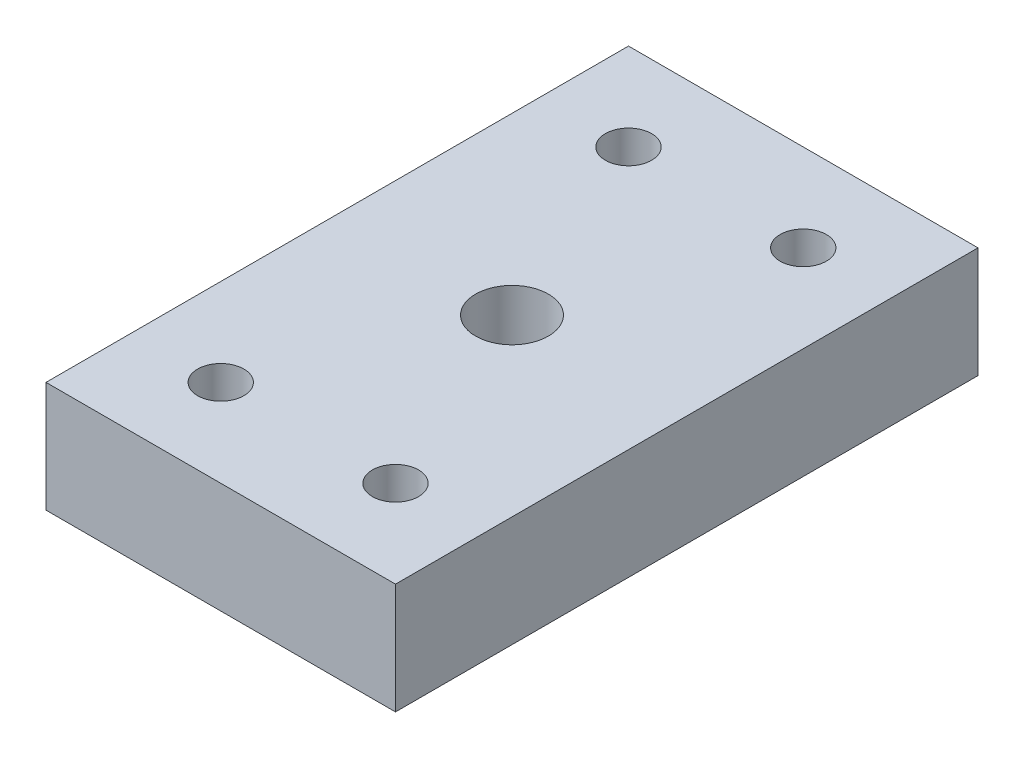
ISO-10303-21;
HEADER;
FILE_DESCRIPTION(('STEP AP214'),'2;1');
FILE_NAME('part.step','',(''),(''),'','','');
FILE_SCHEMA(('AUTOMOTIVE_DESIGN { 1 0 10303 214 1 1 1 1 }'));
ENDSEC;
DATA;
#1=APPLICATION_CONTEXT('core data for automotive mechanical design processes');
#2=APPLICATION_PROTOCOL_DEFINITION('international standard','automotive_design',2000,#1);
#3=PRODUCT_CONTEXT('',#1,'mechanical');
#4=PRODUCT('Part','Part','',(#3));
#5=PRODUCT_RELATED_PRODUCT_CATEGORY('part','',(#4));
#6=PRODUCT_DEFINITION_FORMATION('','',#4);
#7=PRODUCT_DEFINITION_CONTEXT('part definition',#1,'design');
#8=PRODUCT_DEFINITION('design','',#6,#7);
#9=PRODUCT_DEFINITION_SHAPE('','',#8);
#10=(LENGTH_UNIT() NAMED_UNIT(*) SI_UNIT(.MILLI.,.METRE.));
#11=(NAMED_UNIT(*) PLANE_ANGLE_UNIT() SI_UNIT($,.RADIAN.));
#12=(NAMED_UNIT(*) SI_UNIT($,.STERADIAN.) SOLID_ANGLE_UNIT());
#13=UNCERTAINTY_MEASURE_WITH_UNIT(LENGTH_MEASURE(1.E-05),#10,'distance_accuracy_value','');
#14=(GEOMETRIC_REPRESENTATION_CONTEXT(3) GLOBAL_UNCERTAINTY_ASSIGNED_CONTEXT((#13)) GLOBAL_UNIT_ASSIGNED_CONTEXT((#10,
#11,#12)) REPRESENTATION_CONTEXT('',''));
#15=CARTESIAN_POINT('',(0.,0.,0.));
#16=DIRECTION('',(0.,0.,1.));
#17=DIRECTION('',(1.,0.,0.));
#18=AXIS2_PLACEMENT_3D('',#15,#16,#17);
#19=CARTESIAN_POINT('',(38.1,24.13,63.5));
#20=DIRECTION('',(-1.,0.,0.));
#21=DIRECTION('',(0.,0.,1.));
#22=AXIS2_PLACEMENT_3D('',#19,#20,#21);
#23=PLANE('',#22);
#24=DIRECTION('',(0.,0.,-1.));
#25=VECTOR('',#24,1.);
#26=CARTESIAN_POINT('',(38.1,0.,63.5));
#27=LINE('',#26,#25);
#28=CARTESIAN_POINT('',(38.1,0.,63.5));
#29=VERTEX_POINT('',#28);
#30=CARTESIAN_POINT('',(38.1,0.,-63.5));
#31=VERTEX_POINT('',#30);
#32=EDGE_CURVE('E95',#29,#31,#27,.T.);
#33=ORIENTED_EDGE('',*,*,#32,.T.);
#34=DIRECTION('',(0.,-1.,0.));
#35=VECTOR('',#34,1.);
#36=CARTESIAN_POINT('',(38.1,24.13,-63.5));
#37=LINE('',#36,#35);
#38=CARTESIAN_POINT('',(38.1,24.13,-63.5));
#39=VERTEX_POINT('',#38);
#40=EDGE_CURVE('E11',#39,#31,#37,.T.);
#41=ORIENTED_EDGE('',*,*,#40,.F.);
#42=DIRECTION('',(0.,0.,-1.));
#43=VECTOR('',#42,1.);
#44=CARTESIAN_POINT('',(38.1,24.13,63.5));
#45=LINE('',#44,#43);
#46=CARTESIAN_POINT('',(38.1,24.13,63.5));
#47=VERTEX_POINT('',#46);
#48=EDGE_CURVE('E83',#47,#39,#45,.T.);
#49=ORIENTED_EDGE('',*,*,#48,.F.);
#50=DIRECTION('',(0.,-1.,0.));
#51=VECTOR('',#50,1.);
#52=CARTESIAN_POINT('',(38.1,24.13,63.5));
#53=LINE('',#52,#51);
#54=EDGE_CURVE('E91',#47,#29,#53,.T.);
#55=ORIENTED_EDGE('',*,*,#54,.T.);
#56=EDGE_LOOP('',(#33,#41,#49,#55));
#57=FACE_BOUND('',#56,.T.);
#58=ADVANCED_FACE('F32',(#57),#23,.F.);
#59=CARTESIAN_POINT('',(-38.1,24.13,-63.5));
#60=DIRECTION('',(0.,0.,1.));
#61=DIRECTION('',(1.,0.,0.));
#62=AXIS2_PLACEMENT_3D('',#59,#60,#61);
#63=PLANE('',#62);
#64=DIRECTION('',(-1.,0.,0.));
#65=VECTOR('',#64,1.);
#66=CARTESIAN_POINT('',(-38.1,0.,-63.5));
#67=LINE('',#66,#65);
#68=CARTESIAN_POINT('',(-38.1,0.,-63.5));
#69=VERTEX_POINT('',#68);
#70=EDGE_CURVE('E87',#31,#69,#67,.T.);
#71=ORIENTED_EDGE('',*,*,#70,.T.);
#72=DIRECTION('',(0.,-1.,0.));
#73=VECTOR('',#72,1.);
#74=CARTESIAN_POINT('',(-38.1,24.13,-63.5));
#75=LINE('',#74,#73);
#76=CARTESIAN_POINT('',(-38.1,24.13,-63.5));
#77=VERTEX_POINT('',#76);
#78=EDGE_CURVE('E40',#77,#69,#75,.T.);
#79=ORIENTED_EDGE('',*,*,#78,.F.);
#80=DIRECTION('',(-1.,0.,0.));
#81=VECTOR('',#80,1.);
#82=CARTESIAN_POINT('',(-38.1,24.13,-63.5));
#83=LINE('',#82,#81);
#84=EDGE_CURVE('E78',#39,#77,#83,.T.);
#85=ORIENTED_EDGE('',*,*,#84,.F.);
#86=ORIENTED_EDGE('',*,*,#40,.T.);
#87=EDGE_LOOP('',(#71,#79,#85,#86));
#88=FACE_BOUND('',#87,.T.);
#89=ADVANCED_FACE('F86',(#88),#63,.F.);
#90=CARTESIAN_POINT('',(-38.1,24.13,63.5));
#91=DIRECTION('',(1.,0.,0.));
#92=DIRECTION('',(0.,0.,-1.));
#93=AXIS2_PLACEMENT_3D('',#90,#91,#92);
#94=PLANE('',#93);
#95=DIRECTION('',(0.,0.,1.));
#96=VECTOR('',#95,1.);
#97=CARTESIAN_POINT('',(-38.1,0.,63.5));
#98=LINE('',#97,#96);
#99=CARTESIAN_POINT('',(-38.1,0.,63.5));
#100=VERTEX_POINT('',#99);
#101=EDGE_CURVE('E65',#69,#100,#98,.T.);
#102=ORIENTED_EDGE('',*,*,#101,.T.);
#103=DIRECTION('',(0.,-1.,0.));
#104=VECTOR('',#103,1.);
#105=CARTESIAN_POINT('',(-38.1,24.13,63.5));
#106=LINE('',#105,#104);
#107=CARTESIAN_POINT('',(-38.1,24.13,63.5));
#108=VERTEX_POINT('',#107);
#109=EDGE_CURVE('E88',#108,#100,#106,.T.);
#110=ORIENTED_EDGE('',*,*,#109,.F.);
#111=DIRECTION('',(0.,0.,1.));
#112=VECTOR('',#111,1.);
#113=CARTESIAN_POINT('',(-38.1,24.13,63.5));
#114=LINE('',#113,#112);
#115=EDGE_CURVE('E81',#77,#108,#114,.T.);
#116=ORIENTED_EDGE('',*,*,#115,.F.);
#117=ORIENTED_EDGE('',*,*,#78,.T.);
#118=EDGE_LOOP('',(#102,#110,#116,#117));
#119=FACE_BOUND('',#118,.T.);
#120=ADVANCED_FACE('F89',(#119),#94,.F.);
#121=CARTESIAN_POINT('',(-38.1,24.13,63.5));
#122=DIRECTION('',(0.,0.,-1.));
#123=DIRECTION('',(-1.,0.,0.));
#124=AXIS2_PLACEMENT_3D('',#121,#122,#123);
#125=PLANE('',#124);
#126=DIRECTION('',(1.,0.,0.));
#127=VECTOR('',#126,1.);
#128=CARTESIAN_POINT('',(-38.1,0.,63.5));
#129=LINE('',#128,#127);
#130=EDGE_CURVE('E71',#100,#29,#129,.T.);
#131=ORIENTED_EDGE('',*,*,#130,.T.);
#132=ORIENTED_EDGE('',*,*,#54,.F.);
#133=DIRECTION('',(1.,0.,0.));
#134=VECTOR('',#133,1.);
#135=CARTESIAN_POINT('',(-38.1,24.13,63.5));
#136=LINE('',#135,#134);
#137=EDGE_CURVE('E48',#108,#47,#136,.T.);
#138=ORIENTED_EDGE('',*,*,#137,.F.);
#139=ORIENTED_EDGE('',*,*,#109,.T.);
#140=EDGE_LOOP('',(#131,#132,#138,#139));
#141=FACE_BOUND('',#140,.T.);
#142=ADVANCED_FACE('F103',(#141),#125,.F.);
#143=CARTESIAN_POINT('',(0.,24.13,0.));
#144=DIRECTION('',(0.,-1.,0.));
#145=DIRECTION('',(0.,0.,-1.));
#146=AXIS2_PLACEMENT_3D('',#143,#144,#145);
#147=PLANE('',#146);
#148=CARTESIAN_POINT('',(-19.05,24.13,44.45));
#149=DIRECTION('',(0.,1.,0.));
#150=DIRECTION('',(0.,0.,1.));
#151=AXIS2_PLACEMENT_3D('',#148,#149,#150);
#152=CIRCLE('',#151,5.0419);
#153=CARTESIAN_POINT('',(-19.05,24.13,49.4919));
#154=VERTEX_POINT('',#153);
#155=EDGE_CURVE('E133',#154,#154,#152,.T.);
#156=ORIENTED_EDGE('',*,*,#155,.F.);
#157=EDGE_LOOP('',(#156));
#158=FACE_BOUND('',#157,.T.);
#159=CARTESIAN_POINT('',(19.05,24.13,44.45));
#160=DIRECTION('',(0.,1.,0.));
#161=DIRECTION('',(0.,0.,1.));
#162=AXIS2_PLACEMENT_3D('',#159,#160,#161);
#163=CIRCLE('',#162,5.0419);
#164=CARTESIAN_POINT('',(19.05,24.13,49.4919));
#165=VERTEX_POINT('',#164);
#166=EDGE_CURVE('E127',#165,#165,#163,.T.);
#167=ORIENTED_EDGE('',*,*,#166,.F.);
#168=EDGE_LOOP('',(#167));
#169=FACE_BOUND('',#168,.T.);
#170=CARTESIAN_POINT('',(19.05,24.13,-44.45));
#171=DIRECTION('',(0.,1.,0.));
#172=DIRECTION('',(0.,0.,1.));
#173=AXIS2_PLACEMENT_3D('',#170,#171,#172);
#174=CIRCLE('',#173,5.0419);
#175=CARTESIAN_POINT('',(19.05,24.13,-39.4081));
#176=VERTEX_POINT('',#175);
#177=EDGE_CURVE('E121',#176,#176,#174,.T.);
#178=ORIENTED_EDGE('',*,*,#177,.F.);
#179=EDGE_LOOP('',(#178));
#180=FACE_BOUND('',#179,.T.);
#181=CARTESIAN_POINT('',(-19.05,24.13,-44.45));
#182=DIRECTION('',(0.,1.,0.));
#183=DIRECTION('',(0.,0.,1.));
#184=AXIS2_PLACEMENT_3D('',#181,#182,#183);
#185=CIRCLE('',#184,5.0419);
#186=CARTESIAN_POINT('',(-19.05,24.13,-39.4081));
#187=VERTEX_POINT('',#186);
#188=EDGE_CURVE('E115',#187,#187,#185,.T.);
#189=ORIENTED_EDGE('',*,*,#188,.F.);
#190=EDGE_LOOP('',(#189));
#191=FACE_BOUND('',#190,.T.);
#192=CARTESIAN_POINT('',(0.,24.13,0.));
#193=DIRECTION('',(0.,1.,0.));
#194=DIRECTION('',(0.,0.,1.));
#195=AXIS2_PLACEMENT_3D('',#192,#193,#194);
#196=CIRCLE('',#195,7.9375);
#197=CARTESIAN_POINT('',(0.,24.13,7.9375));
#198=VERTEX_POINT('',#197);
#199=EDGE_CURVE('E109',#198,#198,#196,.T.);
#200=ORIENTED_EDGE('',*,*,#199,.F.);
#201=EDGE_LOOP('',(#200));
#202=FACE_BOUND('',#201,.T.);
#203=ORIENTED_EDGE('',*,*,#48,.T.);
#204=ORIENTED_EDGE('',*,*,#84,.T.);
#205=ORIENTED_EDGE('',*,*,#115,.T.);
#206=ORIENTED_EDGE('',*,*,#137,.T.);
#207=EDGE_LOOP('',(#203,#204,#205,#206));
#208=FACE_BOUND('',#207,.T.);
#209=ADVANCED_FACE('F79',(#158,#169,#180,#191,#202,#208),#147,.F.);
#210=CARTESIAN_POINT('',(0.,0.,0.));
#211=DIRECTION('',(0.,-1.,0.));
#212=DIRECTION('',(0.,0.,-1.));
#213=AXIS2_PLACEMENT_3D('',#210,#211,#212);
#214=PLANE('',#213);
#215=CARTESIAN_POINT('',(-19.05,0.,44.45));
#216=DIRECTION('',(0.,1.,0.));
#217=DIRECTION('',(0.,0.,1.));
#218=AXIS2_PLACEMENT_3D('',#215,#216,#217);
#219=CIRCLE('',#218,5.0419);
#220=CARTESIAN_POINT('',(-19.05,0.,49.4919));
#221=VERTEX_POINT('',#220);
#222=EDGE_CURVE('E130',#221,#221,#219,.T.);
#223=ORIENTED_EDGE('',*,*,#222,.T.);
#224=EDGE_LOOP('',(#223));
#225=FACE_BOUND('',#224,.T.);
#226=CARTESIAN_POINT('',(19.05,0.,44.45));
#227=DIRECTION('',(0.,1.,0.));
#228=DIRECTION('',(0.,0.,1.));
#229=AXIS2_PLACEMENT_3D('',#226,#227,#228);
#230=CIRCLE('',#229,5.0419);
#231=CARTESIAN_POINT('',(19.05,0.,49.4919));
#232=VERTEX_POINT('',#231);
#233=EDGE_CURVE('E124',#232,#232,#230,.T.);
#234=ORIENTED_EDGE('',*,*,#233,.T.);
#235=EDGE_LOOP('',(#234));
#236=FACE_BOUND('',#235,.T.);
#237=CARTESIAN_POINT('',(19.05,0.,-44.45));
#238=DIRECTION('',(0.,1.,0.));
#239=DIRECTION('',(0.,0.,1.));
#240=AXIS2_PLACEMENT_3D('',#237,#238,#239);
#241=CIRCLE('',#240,5.0419);
#242=CARTESIAN_POINT('',(19.05,0.,-39.4081));
#243=VERTEX_POINT('',#242);
#244=EDGE_CURVE('E118',#243,#243,#241,.T.);
#245=ORIENTED_EDGE('',*,*,#244,.T.);
#246=EDGE_LOOP('',(#245));
#247=FACE_BOUND('',#246,.T.);
#248=CARTESIAN_POINT('',(-19.05,0.,-44.45));
#249=DIRECTION('',(0.,1.,0.));
#250=DIRECTION('',(0.,0.,1.));
#251=AXIS2_PLACEMENT_3D('',#248,#249,#250);
#252=CIRCLE('',#251,5.0419);
#253=CARTESIAN_POINT('',(-19.05,0.,-39.4081));
#254=VERTEX_POINT('',#253);
#255=EDGE_CURVE('E112',#254,#254,#252,.T.);
#256=ORIENTED_EDGE('',*,*,#255,.T.);
#257=EDGE_LOOP('',(#256));
#258=FACE_BOUND('',#257,.T.);
#259=CARTESIAN_POINT('',(0.,0.,0.));
#260=DIRECTION('',(0.,1.,0.));
#261=DIRECTION('',(0.,0.,1.));
#262=AXIS2_PLACEMENT_3D('',#259,#260,#261);
#263=CIRCLE('',#262,7.9375);
#264=CARTESIAN_POINT('',(0.,0.,7.9375));
#265=VERTEX_POINT('',#264);
#266=EDGE_CURVE('E98',#265,#265,#263,.T.);
#267=ORIENTED_EDGE('',*,*,#266,.T.);
#268=EDGE_LOOP('',(#267));
#269=FACE_BOUND('',#268,.T.);
#270=ORIENTED_EDGE('',*,*,#32,.F.);
#271=ORIENTED_EDGE('',*,*,#130,.F.);
#272=ORIENTED_EDGE('',*,*,#101,.F.);
#273=ORIENTED_EDGE('',*,*,#70,.F.);
#274=EDGE_LOOP('',(#270,#271,#272,#273));
#275=FACE_BOUND('',#274,.T.);
#276=ADVANCED_FACE('F106',(#225,#236,#247,#258,#269,#275),#214,.T.);
#277=CARTESIAN_POINT('',(0.,0.,0.));
#278=DIRECTION('',(0.,1.,0.));
#279=DIRECTION('',(0.,0.,1.));
#280=AXIS2_PLACEMENT_3D('',#277,#278,#279);
#281=CYLINDRICAL_SURFACE('',#280,7.9375);
#282=CARTESIAN_POINT('',(0.,0.,7.9375));
#283=CARTESIAN_POINT('',(0.,0.251354166666666,7.9375));
#284=CARTESIAN_POINT('',(0.,0.502708333333333,7.9375));
#285=CARTESIAN_POINT('',(0.,1.00541666666667,7.9375));
#286=CARTESIAN_POINT('',(0.,1.25677083333333,7.9375));
#287=CARTESIAN_POINT('',(0.,1.75947916666667,7.9375));
#288=CARTESIAN_POINT('',(0.,2.01083333333333,7.9375));
#289=CARTESIAN_POINT('',(0.,2.51354166666667,7.9375));
#290=CARTESIAN_POINT('',(0.,2.76489583333333,7.9375));
#291=CARTESIAN_POINT('',(0.,3.26760416666667,7.9375));
#292=CARTESIAN_POINT('',(0.,3.51895833333333,7.9375));
#293=CARTESIAN_POINT('',(0.,4.02166666666667,7.9375));
#294=CARTESIAN_POINT('',(0.,4.27302083333333,7.9375));
#295=CARTESIAN_POINT('',(0.,4.77572916666667,7.9375));
#296=CARTESIAN_POINT('',(0.,5.02708333333333,7.9375));
#297=CARTESIAN_POINT('',(0.,5.52979166666667,7.9375));
#298=CARTESIAN_POINT('',(0.,5.78114583333333,7.9375));
#299=CARTESIAN_POINT('',(0.,6.28385416666667,7.9375));
#300=CARTESIAN_POINT('',(0.,6.53520833333333,7.9375));
#301=CARTESIAN_POINT('',(0.,7.03791666666667,7.9375));
#302=CARTESIAN_POINT('',(0.,7.28927083333333,7.9375));
#303=CARTESIAN_POINT('',(0.,7.79197916666666,7.9375));
#304=CARTESIAN_POINT('',(0.,8.04333333333333,7.9375));
#305=CARTESIAN_POINT('',(0.,8.54604166666667,7.9375));
#306=CARTESIAN_POINT('',(0.,8.79739583333333,7.9375));
#307=CARTESIAN_POINT('',(0.,9.30010416666667,7.9375));
#308=CARTESIAN_POINT('',(0.,9.55145833333333,7.9375));
#309=CARTESIAN_POINT('',(0.,10.0541666666667,7.9375));
#310=CARTESIAN_POINT('',(0.,10.3055208333333,7.9375));
#311=CARTESIAN_POINT('',(0.,10.8082291666667,7.9375));
#312=CARTESIAN_POINT('',(0.,11.0595833333333,7.9375));
#313=CARTESIAN_POINT('',(0.,11.5622916666667,7.9375));
#314=CARTESIAN_POINT('',(0.,11.8136458333333,7.9375));
#315=CARTESIAN_POINT('',(0.,12.3163541666667,7.9375));
#316=CARTESIAN_POINT('',(0.,12.5677083333333,7.9375));
#317=CARTESIAN_POINT('',(0.,13.0704166666667,7.9375));
#318=CARTESIAN_POINT('',(0.,13.3217708333333,7.9375));
#319=CARTESIAN_POINT('',(0.,13.8244791666667,7.9375));
#320=CARTESIAN_POINT('',(0.,14.0758333333333,7.9375));
#321=CARTESIAN_POINT('',(0.,14.5785416666667,7.9375));
#322=CARTESIAN_POINT('',(0.,14.8298958333333,7.9375));
#323=CARTESIAN_POINT('',(0.,15.3326041666667,7.9375));
#324=CARTESIAN_POINT('',(0.,15.5839583333333,7.9375));
#325=CARTESIAN_POINT('',(0.,16.0866666666667,7.9375));
#326=CARTESIAN_POINT('',(0.,16.3380208333333,7.9375));
#327=CARTESIAN_POINT('',(0.,16.8407291666667,7.9375));
#328=CARTESIAN_POINT('',(0.,17.0920833333333,7.9375));
#329=CARTESIAN_POINT('',(0.,17.5947916666667,7.9375));
#330=CARTESIAN_POINT('',(0.,17.8461458333333,7.9375));
#331=CARTESIAN_POINT('',(0.,18.3488541666667,7.9375));
#332=CARTESIAN_POINT('',(0.,18.6002083333333,7.9375));
#333=CARTESIAN_POINT('',(0.,19.1029166666667,7.9375));
#334=CARTESIAN_POINT('',(0.,19.3542708333333,7.9375));
#335=CARTESIAN_POINT('',(0.,19.8569791666667,7.9375));
#336=CARTESIAN_POINT('',(0.,20.1083333333333,7.9375));
#337=CARTESIAN_POINT('',(0.,20.6110416666667,7.9375));
#338=CARTESIAN_POINT('',(0.,20.8623958333333,7.9375));
#339=CARTESIAN_POINT('',(0.,21.3651041666667,7.9375));
#340=CARTESIAN_POINT('',(0.,21.6164583333333,7.9375));
#341=CARTESIAN_POINT('',(0.,22.1191666666667,7.9375));
#342=CARTESIAN_POINT('',(0.,22.3705208333333,7.9375));
#343=CARTESIAN_POINT('',(0.,22.8732291666667,7.9375));
#344=CARTESIAN_POINT('',(0.,23.1245833333333,7.9375));
#345=CARTESIAN_POINT('',(0.,23.6272916666667,7.9375));
#346=CARTESIAN_POINT('',(0.,23.8786458333333,7.9375));
#347=CARTESIAN_POINT('',(0.,24.13,7.9375));
#348=B_SPLINE_CURVE_WITH_KNOTS('',3,(#282,#283,#284,#285,#286,#287,#288,#289,#290,#291,#292,
#293,#294,#295,#296,#297,#298,#299,#300,#301,#302,#303,#304,#305,#306,#307,#308,#309,#310,#311,
#312,#313,#314,#315,#316,#317,#318,#319,#320,#321,#322,#323,#324,#325,#326,#327,#328,#329,#330,
#331,#332,#333,#334,#335,#336,#337,#338,#339,#340,#341,#342,#343,#344,#345,#346,#347),
.UNSPECIFIED.,.F.,.F.,(4,2,2,2,2,2,2,2,2,2,2,2,2,2,2,2,2,2,2,2,2,2,2,2,2,2,2,2,2,2,2,2,4),(0.,
0.7540625,1.508125,2.2621875,3.01625,3.7703125,4.524375,5.2784375,6.0325,6.7865625,7.540625,
8.2946875,9.04875,9.8028125,10.556875,11.3109375,12.065,12.8190625,13.573125,14.3271875,
15.08125,15.8353125,16.589375,17.3434375,18.0975,18.8515625,19.605625,20.3596875,21.11375,
21.8678125,22.621875,23.3759375,24.13),.UNSPECIFIED.);
#349=EDGE_CURVE('BSEAM159',#265,#198,#348,.T.);
#350=ORIENTED_EDGE('',*,*,#266,.F.);
#351=ORIENTED_EDGE('',*,*,#199,.T.);
#352=ORIENTED_EDGE('',*,*,#349,.T.);
#353=ORIENTED_EDGE('',*,*,#349,.F.);
#354=EDGE_LOOP('',(#350,#352,#351,#353));
#355=FACE_BOUND('',#354,.T.);
#356=ADVANCED_FACE('F159',(#355),#281,.F.);
#357=CARTESIAN_POINT('',(-19.05,0.,-44.45));
#358=DIRECTION('',(0.,1.,0.));
#359=DIRECTION('',(0.,0.,1.));
#360=AXIS2_PLACEMENT_3D('',#357,#358,#359);
#361=CYLINDRICAL_SURFACE('',#360,5.0419);
#362=CARTESIAN_POINT('',(-19.05,0.,-39.4081));
#363=CARTESIAN_POINT('',(-19.05,0.251354166666666,-39.4081));
#364=CARTESIAN_POINT('',(-19.05,0.502708333333333,-39.4081));
#365=CARTESIAN_POINT('',(-19.05,1.00541666666667,-39.4081));
#366=CARTESIAN_POINT('',(-19.05,1.25677083333333,-39.4081));
#367=CARTESIAN_POINT('',(-19.05,1.75947916666667,-39.4081));
#368=CARTESIAN_POINT('',(-19.05,2.01083333333333,-39.4081));
#369=CARTESIAN_POINT('',(-19.05,2.51354166666667,-39.4081));
#370=CARTESIAN_POINT('',(-19.05,2.76489583333333,-39.4081));
#371=CARTESIAN_POINT('',(-19.05,3.26760416666667,-39.4081));
#372=CARTESIAN_POINT('',(-19.05,3.51895833333333,-39.4081));
#373=CARTESIAN_POINT('',(-19.05,4.02166666666667,-39.4081));
#374=CARTESIAN_POINT('',(-19.05,4.27302083333333,-39.4081));
#375=CARTESIAN_POINT('',(-19.05,4.77572916666667,-39.4081));
#376=CARTESIAN_POINT('',(-19.05,5.02708333333333,-39.4081));
#377=CARTESIAN_POINT('',(-19.05,5.52979166666667,-39.4081));
#378=CARTESIAN_POINT('',(-19.05,5.78114583333333,-39.4081));
#379=CARTESIAN_POINT('',(-19.05,6.28385416666667,-39.4081));
#380=CARTESIAN_POINT('',(-19.05,6.53520833333333,-39.4081));
#381=CARTESIAN_POINT('',(-19.05,7.03791666666667,-39.4081));
#382=CARTESIAN_POINT('',(-19.05,7.28927083333333,-39.4081));
#383=CARTESIAN_POINT('',(-19.05,7.79197916666666,-39.4081));
#384=CARTESIAN_POINT('',(-19.05,8.04333333333333,-39.4081));
#385=CARTESIAN_POINT('',(-19.05,8.54604166666667,-39.4081));
#386=CARTESIAN_POINT('',(-19.05,8.79739583333333,-39.4081));
#387=CARTESIAN_POINT('',(-19.05,9.30010416666667,-39.4081));
#388=CARTESIAN_POINT('',(-19.05,9.55145833333333,-39.4081));
#389=CARTESIAN_POINT('',(-19.05,10.0541666666667,-39.4081));
#390=CARTESIAN_POINT('',(-19.05,10.3055208333333,-39.4081));
#391=CARTESIAN_POINT('',(-19.05,10.8082291666667,-39.4081));
#392=CARTESIAN_POINT('',(-19.05,11.0595833333333,-39.4081));
#393=CARTESIAN_POINT('',(-19.05,11.5622916666667,-39.4081));
#394=CARTESIAN_POINT('',(-19.05,11.8136458333333,-39.4081));
#395=CARTESIAN_POINT('',(-19.05,12.3163541666667,-39.4081));
#396=CARTESIAN_POINT('',(-19.05,12.5677083333333,-39.4081));
#397=CARTESIAN_POINT('',(-19.05,13.0704166666667,-39.4081));
#398=CARTESIAN_POINT('',(-19.05,13.3217708333333,-39.4081));
#399=CARTESIAN_POINT('',(-19.05,13.8244791666667,-39.4081));
#400=CARTESIAN_POINT('',(-19.05,14.0758333333333,-39.4081));
#401=CARTESIAN_POINT('',(-19.05,14.5785416666667,-39.4081));
#402=CARTESIAN_POINT('',(-19.05,14.8298958333333,-39.4081));
#403=CARTESIAN_POINT('',(-19.05,15.3326041666667,-39.4081));
#404=CARTESIAN_POINT('',(-19.05,15.5839583333333,-39.4081));
#405=CARTESIAN_POINT('',(-19.05,16.0866666666667,-39.4081));
#406=CARTESIAN_POINT('',(-19.05,16.3380208333333,-39.4081));
#407=CARTESIAN_POINT('',(-19.05,16.8407291666667,-39.4081));
#408=CARTESIAN_POINT('',(-19.05,17.0920833333333,-39.4081));
#409=CARTESIAN_POINT('',(-19.05,17.5947916666667,-39.4081));
#410=CARTESIAN_POINT('',(-19.05,17.8461458333333,-39.4081));
#411=CARTESIAN_POINT('',(-19.05,18.3488541666667,-39.4081));
#412=CARTESIAN_POINT('',(-19.05,18.6002083333333,-39.4081));
#413=CARTESIAN_POINT('',(-19.05,19.1029166666667,-39.4081));
#414=CARTESIAN_POINT('',(-19.05,19.3542708333333,-39.4081));
#415=CARTESIAN_POINT('',(-19.05,19.8569791666667,-39.4081));
#416=CARTESIAN_POINT('',(-19.05,20.1083333333333,-39.4081));
#417=CARTESIAN_POINT('',(-19.05,20.6110416666667,-39.4081));
#418=CARTESIAN_POINT('',(-19.05,20.8623958333333,-39.4081));
#419=CARTESIAN_POINT('',(-19.05,21.3651041666667,-39.4081));
#420=CARTESIAN_POINT('',(-19.05,21.6164583333333,-39.4081));
#421=CARTESIAN_POINT('',(-19.05,22.1191666666667,-39.4081));
#422=CARTESIAN_POINT('',(-19.05,22.3705208333333,-39.4081));
#423=CARTESIAN_POINT('',(-19.05,22.8732291666667,-39.4081));
#424=CARTESIAN_POINT('',(-19.05,23.1245833333333,-39.4081));
#425=CARTESIAN_POINT('',(-19.05,23.6272916666667,-39.4081));
#426=CARTESIAN_POINT('',(-19.05,23.8786458333333,-39.4081));
#427=CARTESIAN_POINT('',(-19.05,24.13,-39.4081));
#428=B_SPLINE_CURVE_WITH_KNOTS('',3,(#362,#363,#364,#365,#366,#367,#368,#369,#370,#371,#372,
#373,#374,#375,#376,#377,#378,#379,#380,#381,#382,#383,#384,#385,#386,#387,#388,#389,#390,#391,
#392,#393,#394,#395,#396,#397,#398,#399,#400,#401,#402,#403,#404,#405,#406,#407,#408,#409,#410,
#411,#412,#413,#414,#415,#416,#417,#418,#419,#420,#421,#422,#423,#424,#425,#426,#427),
.UNSPECIFIED.,.F.,.F.,(4,2,2,2,2,2,2,2,2,2,2,2,2,2,2,2,2,2,2,2,2,2,2,2,2,2,2,2,2,2,2,2,4),(0.,
0.7540625,1.508125,2.2621875,3.01625,3.7703125,4.524375,5.2784375,6.0325,6.7865625,7.540625,
8.2946875,9.04875,9.8028125,10.556875,11.3109375,12.065,12.8190625,13.573125,14.3271875,
15.08125,15.8353125,16.589375,17.3434375,18.0975,18.8515625,19.605625,20.3596875,21.11375,
21.8678125,22.621875,23.3759375,24.13),.UNSPECIFIED.);
#429=EDGE_CURVE('BSEAM161',#254,#187,#428,.T.);
#430=ORIENTED_EDGE('',*,*,#255,.F.);
#431=ORIENTED_EDGE('',*,*,#188,.T.);
#432=ORIENTED_EDGE('',*,*,#429,.T.);
#433=ORIENTED_EDGE('',*,*,#429,.F.);
#434=EDGE_LOOP('',(#430,#432,#431,#433));
#435=FACE_BOUND('',#434,.T.);
#436=ADVANCED_FACE('F161',(#435),#361,.F.);
#437=CARTESIAN_POINT('',(19.05,0.,-44.45));
#438=DIRECTION('',(0.,1.,0.));
#439=DIRECTION('',(0.,0.,1.));
#440=AXIS2_PLACEMENT_3D('',#437,#438,#439);
#441=CYLINDRICAL_SURFACE('',#440,5.0419);
#442=CARTESIAN_POINT('',(19.05,0.,-39.4081));
#443=CARTESIAN_POINT('',(19.05,0.251354166666666,-39.4081));
#444=CARTESIAN_POINT('',(19.05,0.502708333333333,-39.4081));
#445=CARTESIAN_POINT('',(19.05,1.00541666666667,-39.4081));
#446=CARTESIAN_POINT('',(19.05,1.25677083333333,-39.4081));
#447=CARTESIAN_POINT('',(19.05,1.75947916666667,-39.4081));
#448=CARTESIAN_POINT('',(19.05,2.01083333333333,-39.4081));
#449=CARTESIAN_POINT('',(19.05,2.51354166666667,-39.4081));
#450=CARTESIAN_POINT('',(19.05,2.76489583333333,-39.4081));
#451=CARTESIAN_POINT('',(19.05,3.26760416666667,-39.4081));
#452=CARTESIAN_POINT('',(19.05,3.51895833333333,-39.4081));
#453=CARTESIAN_POINT('',(19.05,4.02166666666667,-39.4081));
#454=CARTESIAN_POINT('',(19.05,4.27302083333333,-39.4081));
#455=CARTESIAN_POINT('',(19.05,4.77572916666667,-39.4081));
#456=CARTESIAN_POINT('',(19.05,5.02708333333333,-39.4081));
#457=CARTESIAN_POINT('',(19.05,5.52979166666667,-39.4081));
#458=CARTESIAN_POINT('',(19.05,5.78114583333333,-39.4081));
#459=CARTESIAN_POINT('',(19.05,6.28385416666667,-39.4081));
#460=CARTESIAN_POINT('',(19.05,6.53520833333333,-39.4081));
#461=CARTESIAN_POINT('',(19.05,7.03791666666667,-39.4081));
#462=CARTESIAN_POINT('',(19.05,7.28927083333333,-39.4081));
#463=CARTESIAN_POINT('',(19.05,7.79197916666666,-39.4081));
#464=CARTESIAN_POINT('',(19.05,8.04333333333333,-39.4081));
#465=CARTESIAN_POINT('',(19.05,8.54604166666667,-39.4081));
#466=CARTESIAN_POINT('',(19.05,8.79739583333333,-39.4081));
#467=CARTESIAN_POINT('',(19.05,9.30010416666667,-39.4081));
#468=CARTESIAN_POINT('',(19.05,9.55145833333333,-39.4081));
#469=CARTESIAN_POINT('',(19.05,10.0541666666667,-39.4081));
#470=CARTESIAN_POINT('',(19.05,10.3055208333333,-39.4081));
#471=CARTESIAN_POINT('',(19.05,10.8082291666667,-39.4081));
#472=CARTESIAN_POINT('',(19.05,11.0595833333333,-39.4081));
#473=CARTESIAN_POINT('',(19.05,11.5622916666667,-39.4081));
#474=CARTESIAN_POINT('',(19.05,11.8136458333333,-39.4081));
#475=CARTESIAN_POINT('',(19.05,12.3163541666667,-39.4081));
#476=CARTESIAN_POINT('',(19.05,12.5677083333333,-39.4081));
#477=CARTESIAN_POINT('',(19.05,13.0704166666667,-39.4081));
#478=CARTESIAN_POINT('',(19.05,13.3217708333333,-39.4081));
#479=CARTESIAN_POINT('',(19.05,13.8244791666667,-39.4081));
#480=CARTESIAN_POINT('',(19.05,14.0758333333333,-39.4081));
#481=CARTESIAN_POINT('',(19.05,14.5785416666667,-39.4081));
#482=CARTESIAN_POINT('',(19.05,14.8298958333333,-39.4081));
#483=CARTESIAN_POINT('',(19.05,15.3326041666667,-39.4081));
#484=CARTESIAN_POINT('',(19.05,15.5839583333333,-39.4081));
#485=CARTESIAN_POINT('',(19.05,16.0866666666667,-39.4081));
#486=CARTESIAN_POINT('',(19.05,16.3380208333333,-39.4081));
#487=CARTESIAN_POINT('',(19.05,16.8407291666667,-39.4081));
#488=CARTESIAN_POINT('',(19.05,17.0920833333333,-39.4081));
#489=CARTESIAN_POINT('',(19.05,17.5947916666667,-39.4081));
#490=CARTESIAN_POINT('',(19.05,17.8461458333333,-39.4081));
#491=CARTESIAN_POINT('',(19.05,18.3488541666667,-39.4081));
#492=CARTESIAN_POINT('',(19.05,18.6002083333333,-39.4081));
#493=CARTESIAN_POINT('',(19.05,19.1029166666667,-39.4081));
#494=CARTESIAN_POINT('',(19.05,19.3542708333333,-39.4081));
#495=CARTESIAN_POINT('',(19.05,19.8569791666667,-39.4081));
#496=CARTESIAN_POINT('',(19.05,20.1083333333333,-39.4081));
#497=CARTESIAN_POINT('',(19.05,20.6110416666667,-39.4081));
#498=CARTESIAN_POINT('',(19.05,20.8623958333333,-39.4081));
#499=CARTESIAN_POINT('',(19.05,21.3651041666667,-39.4081));
#500=CARTESIAN_POINT('',(19.05,21.6164583333333,-39.4081));
#501=CARTESIAN_POINT('',(19.05,22.1191666666667,-39.4081));
#502=CARTESIAN_POINT('',(19.05,22.3705208333333,-39.4081));
#503=CARTESIAN_POINT('',(19.05,22.8732291666667,-39.4081));
#504=CARTESIAN_POINT('',(19.05,23.1245833333333,-39.4081));
#505=CARTESIAN_POINT('',(19.05,23.6272916666667,-39.4081));
#506=CARTESIAN_POINT('',(19.05,23.8786458333333,-39.4081));
#507=CARTESIAN_POINT('',(19.05,24.13,-39.4081));
#508=B_SPLINE_CURVE_WITH_KNOTS('',3,(#442,#443,#444,#445,#446,#447,#448,#449,#450,#451,#452,
#453,#454,#455,#456,#457,#458,#459,#460,#461,#462,#463,#464,#465,#466,#467,#468,#469,#470,#471,
#472,#473,#474,#475,#476,#477,#478,#479,#480,#481,#482,#483,#484,#485,#486,#487,#488,#489,#490,
#491,#492,#493,#494,#495,#496,#497,#498,#499,#500,#501,#502,#503,#504,#505,#506,#507),
.UNSPECIFIED.,.F.,.F.,(4,2,2,2,2,2,2,2,2,2,2,2,2,2,2,2,2,2,2,2,2,2,2,2,2,2,2,2,2,2,2,2,4),(0.,
0.7540625,1.508125,2.2621875,3.01625,3.7703125,4.524375,5.2784375,6.0325,6.7865625,7.540625,
8.2946875,9.04875,9.8028125,10.556875,11.3109375,12.065,12.8190625,13.573125,14.3271875,
15.08125,15.8353125,16.589375,17.3434375,18.0975,18.8515625,19.605625,20.3596875,21.11375,
21.8678125,22.621875,23.3759375,24.13),.UNSPECIFIED.);
#509=EDGE_CURVE('BSEAM168',#243,#176,#508,.T.);
#510=ORIENTED_EDGE('',*,*,#244,.F.);
#511=ORIENTED_EDGE('',*,*,#177,.T.);
#512=ORIENTED_EDGE('',*,*,#509,.T.);
#513=ORIENTED_EDGE('',*,*,#509,.F.);
#514=EDGE_LOOP('',(#510,#512,#511,#513));
#515=FACE_BOUND('',#514,.T.);
#516=ADVANCED_FACE('F168',(#515),#441,.F.);
#517=CARTESIAN_POINT('',(19.05,0.,44.45));
#518=DIRECTION('',(0.,1.,0.));
#519=DIRECTION('',(0.,0.,1.));
#520=AXIS2_PLACEMENT_3D('',#517,#518,#519);
#521=CYLINDRICAL_SURFACE('',#520,5.0419);
#522=CARTESIAN_POINT('',(19.05,0.,49.4919));
#523=CARTESIAN_POINT('',(19.05,0.251354166666666,49.4919));
#524=CARTESIAN_POINT('',(19.05,0.502708333333333,49.4919));
#525=CARTESIAN_POINT('',(19.05,1.00541666666667,49.4919));
#526=CARTESIAN_POINT('',(19.05,1.25677083333333,49.4919));
#527=CARTESIAN_POINT('',(19.05,1.75947916666667,49.4919));
#528=CARTESIAN_POINT('',(19.05,2.01083333333333,49.4919));
#529=CARTESIAN_POINT('',(19.05,2.51354166666667,49.4919));
#530=CARTESIAN_POINT('',(19.05,2.76489583333333,49.4919));
#531=CARTESIAN_POINT('',(19.05,3.26760416666667,49.4919));
#532=CARTESIAN_POINT('',(19.05,3.51895833333333,49.4919));
#533=CARTESIAN_POINT('',(19.05,4.02166666666667,49.4919));
#534=CARTESIAN_POINT('',(19.05,4.27302083333333,49.4919));
#535=CARTESIAN_POINT('',(19.05,4.77572916666667,49.4919));
#536=CARTESIAN_POINT('',(19.05,5.02708333333333,49.4919));
#537=CARTESIAN_POINT('',(19.05,5.52979166666667,49.4919));
#538=CARTESIAN_POINT('',(19.05,5.78114583333333,49.4919));
#539=CARTESIAN_POINT('',(19.05,6.28385416666667,49.4919));
#540=CARTESIAN_POINT('',(19.05,6.53520833333333,49.4919));
#541=CARTESIAN_POINT('',(19.05,7.03791666666667,49.4919));
#542=CARTESIAN_POINT('',(19.05,7.28927083333333,49.4919));
#543=CARTESIAN_POINT('',(19.05,7.79197916666666,49.4919));
#544=CARTESIAN_POINT('',(19.05,8.04333333333333,49.4919));
#545=CARTESIAN_POINT('',(19.05,8.54604166666667,49.4919));
#546=CARTESIAN_POINT('',(19.05,8.79739583333333,49.4919));
#547=CARTESIAN_POINT('',(19.05,9.30010416666667,49.4919));
#548=CARTESIAN_POINT('',(19.05,9.55145833333333,49.4919));
#549=CARTESIAN_POINT('',(19.05,10.0541666666667,49.4919));
#550=CARTESIAN_POINT('',(19.05,10.3055208333333,49.4919));
#551=CARTESIAN_POINT('',(19.05,10.8082291666667,49.4919));
#552=CARTESIAN_POINT('',(19.05,11.0595833333333,49.4919));
#553=CARTESIAN_POINT('',(19.05,11.5622916666667,49.4919));
#554=CARTESIAN_POINT('',(19.05,11.8136458333333,49.4919));
#555=CARTESIAN_POINT('',(19.05,12.3163541666667,49.4919));
#556=CARTESIAN_POINT('',(19.05,12.5677083333333,49.4919));
#557=CARTESIAN_POINT('',(19.05,13.0704166666667,49.4919));
#558=CARTESIAN_POINT('',(19.05,13.3217708333333,49.4919));
#559=CARTESIAN_POINT('',(19.05,13.8244791666667,49.4919));
#560=CARTESIAN_POINT('',(19.05,14.0758333333333,49.4919));
#561=CARTESIAN_POINT('',(19.05,14.5785416666667,49.4919));
#562=CARTESIAN_POINT('',(19.05,14.8298958333333,49.4919));
#563=CARTESIAN_POINT('',(19.05,15.3326041666667,49.4919));
#564=CARTESIAN_POINT('',(19.05,15.5839583333333,49.4919));
#565=CARTESIAN_POINT('',(19.05,16.0866666666667,49.4919));
#566=CARTESIAN_POINT('',(19.05,16.3380208333333,49.4919));
#567=CARTESIAN_POINT('',(19.05,16.8407291666667,49.4919));
#568=CARTESIAN_POINT('',(19.05,17.0920833333333,49.4919));
#569=CARTESIAN_POINT('',(19.05,17.5947916666667,49.4919));
#570=CARTESIAN_POINT('',(19.05,17.8461458333333,49.4919));
#571=CARTESIAN_POINT('',(19.05,18.3488541666667,49.4919));
#572=CARTESIAN_POINT('',(19.05,18.6002083333333,49.4919));
#573=CARTESIAN_POINT('',(19.05,19.1029166666667,49.4919));
#574=CARTESIAN_POINT('',(19.05,19.3542708333333,49.4919));
#575=CARTESIAN_POINT('',(19.05,19.8569791666667,49.4919));
#576=CARTESIAN_POINT('',(19.05,20.1083333333333,49.4919));
#577=CARTESIAN_POINT('',(19.05,20.6110416666667,49.4919));
#578=CARTESIAN_POINT('',(19.05,20.8623958333333,49.4919));
#579=CARTESIAN_POINT('',(19.05,21.3651041666667,49.4919));
#580=CARTESIAN_POINT('',(19.05,21.6164583333333,49.4919));
#581=CARTESIAN_POINT('',(19.05,22.1191666666667,49.4919));
#582=CARTESIAN_POINT('',(19.05,22.3705208333333,49.4919));
#583=CARTESIAN_POINT('',(19.05,22.8732291666667,49.4919));
#584=CARTESIAN_POINT('',(19.05,23.1245833333333,49.4919));
#585=CARTESIAN_POINT('',(19.05,23.6272916666667,49.4919));
#586=CARTESIAN_POINT('',(19.05,23.8786458333333,49.4919));
#587=CARTESIAN_POINT('',(19.05,24.13,49.4919));
#588=B_SPLINE_CURVE_WITH_KNOTS('',3,(#522,#523,#524,#525,#526,#527,#528,#529,#530,#531,#532,
#533,#534,#535,#536,#537,#538,#539,#540,#541,#542,#543,#544,#545,#546,#547,#548,#549,#550,#551,
#552,#553,#554,#555,#556,#557,#558,#559,#560,#561,#562,#563,#564,#565,#566,#567,#568,#569,#570,
#571,#572,#573,#574,#575,#576,#577,#578,#579,#580,#581,#582,#583,#584,#585,#586,#587),
.UNSPECIFIED.,.F.,.F.,(4,2,2,2,2,2,2,2,2,2,2,2,2,2,2,2,2,2,2,2,2,2,2,2,2,2,2,2,2,2,2,2,4),(0.,
0.7540625,1.508125,2.2621875,3.01625,3.7703125,4.524375,5.2784375,6.0325,6.7865625,7.540625,
8.2946875,9.04875,9.8028125,10.556875,11.3109375,12.065,12.8190625,13.573125,14.3271875,
15.08125,15.8353125,16.589375,17.3434375,18.0975,18.8515625,19.605625,20.3596875,21.11375,
21.8678125,22.621875,23.3759375,24.13),.UNSPECIFIED.);
#589=EDGE_CURVE('BSEAM144',#232,#165,#588,.T.);
#590=ORIENTED_EDGE('',*,*,#233,.F.);
#591=ORIENTED_EDGE('',*,*,#166,.T.);
#592=ORIENTED_EDGE('',*,*,#589,.T.);
#593=ORIENTED_EDGE('',*,*,#589,.F.);
#594=EDGE_LOOP('',(#590,#592,#591,#593));
#595=FACE_BOUND('',#594,.T.);
#596=ADVANCED_FACE('F144',(#595),#521,.F.);
#597=CARTESIAN_POINT('',(-19.05,0.,44.45));
#598=DIRECTION('',(0.,1.,0.));
#599=DIRECTION('',(0.,0.,1.));
#600=AXIS2_PLACEMENT_3D('',#597,#598,#599);
#601=CYLINDRICAL_SURFACE('',#600,5.0419);
#602=CARTESIAN_POINT('',(-19.05,0.,49.4919));
#603=CARTESIAN_POINT('',(-19.05,0.251354166666666,49.4919));
#604=CARTESIAN_POINT('',(-19.05,0.502708333333333,49.4919));
#605=CARTESIAN_POINT('',(-19.05,1.00541666666667,49.4919));
#606=CARTESIAN_POINT('',(-19.05,1.25677083333333,49.4919));
#607=CARTESIAN_POINT('',(-19.05,1.75947916666667,49.4919));
#608=CARTESIAN_POINT('',(-19.05,2.01083333333333,49.4919));
#609=CARTESIAN_POINT('',(-19.05,2.51354166666667,49.4919));
#610=CARTESIAN_POINT('',(-19.05,2.76489583333333,49.4919));
#611=CARTESIAN_POINT('',(-19.05,3.26760416666667,49.4919));
#612=CARTESIAN_POINT('',(-19.05,3.51895833333333,49.4919));
#613=CARTESIAN_POINT('',(-19.05,4.02166666666667,49.4919));
#614=CARTESIAN_POINT('',(-19.05,4.27302083333333,49.4919));
#615=CARTESIAN_POINT('',(-19.05,4.77572916666667,49.4919));
#616=CARTESIAN_POINT('',(-19.05,5.02708333333333,49.4919));
#617=CARTESIAN_POINT('',(-19.05,5.52979166666667,49.4919));
#618=CARTESIAN_POINT('',(-19.05,5.78114583333333,49.4919));
#619=CARTESIAN_POINT('',(-19.05,6.28385416666667,49.4919));
#620=CARTESIAN_POINT('',(-19.05,6.53520833333333,49.4919));
#621=CARTESIAN_POINT('',(-19.05,7.03791666666667,49.4919));
#622=CARTESIAN_POINT('',(-19.05,7.28927083333333,49.4919));
#623=CARTESIAN_POINT('',(-19.05,7.79197916666666,49.4919));
#624=CARTESIAN_POINT('',(-19.05,8.04333333333333,49.4919));
#625=CARTESIAN_POINT('',(-19.05,8.54604166666667,49.4919));
#626=CARTESIAN_POINT('',(-19.05,8.79739583333333,49.4919));
#627=CARTESIAN_POINT('',(-19.05,9.30010416666667,49.4919));
#628=CARTESIAN_POINT('',(-19.05,9.55145833333333,49.4919));
#629=CARTESIAN_POINT('',(-19.05,10.0541666666667,49.4919));
#630=CARTESIAN_POINT('',(-19.05,10.3055208333333,49.4919));
#631=CARTESIAN_POINT('',(-19.05,10.8082291666667,49.4919));
#632=CARTESIAN_POINT('',(-19.05,11.0595833333333,49.4919));
#633=CARTESIAN_POINT('',(-19.05,11.5622916666667,49.4919));
#634=CARTESIAN_POINT('',(-19.05,11.8136458333333,49.4919));
#635=CARTESIAN_POINT('',(-19.05,12.3163541666667,49.4919));
#636=CARTESIAN_POINT('',(-19.05,12.5677083333333,49.4919));
#637=CARTESIAN_POINT('',(-19.05,13.0704166666667,49.4919));
#638=CARTESIAN_POINT('',(-19.05,13.3217708333333,49.4919));
#639=CARTESIAN_POINT('',(-19.05,13.8244791666667,49.4919));
#640=CARTESIAN_POINT('',(-19.05,14.0758333333333,49.4919));
#641=CARTESIAN_POINT('',(-19.05,14.5785416666667,49.4919));
#642=CARTESIAN_POINT('',(-19.05,14.8298958333333,49.4919));
#643=CARTESIAN_POINT('',(-19.05,15.3326041666667,49.4919));
#644=CARTESIAN_POINT('',(-19.05,15.5839583333333,49.4919));
#645=CARTESIAN_POINT('',(-19.05,16.0866666666667,49.4919));
#646=CARTESIAN_POINT('',(-19.05,16.3380208333333,49.4919));
#647=CARTESIAN_POINT('',(-19.05,16.8407291666667,49.4919));
#648=CARTESIAN_POINT('',(-19.05,17.0920833333333,49.4919));
#649=CARTESIAN_POINT('',(-19.05,17.5947916666667,49.4919));
#650=CARTESIAN_POINT('',(-19.05,17.8461458333333,49.4919));
#651=CARTESIAN_POINT('',(-19.05,18.3488541666667,49.4919));
#652=CARTESIAN_POINT('',(-19.05,18.6002083333333,49.4919));
#653=CARTESIAN_POINT('',(-19.05,19.1029166666667,49.4919));
#654=CARTESIAN_POINT('',(-19.05,19.3542708333333,49.4919));
#655=CARTESIAN_POINT('',(-19.05,19.8569791666667,49.4919));
#656=CARTESIAN_POINT('',(-19.05,20.1083333333333,49.4919));
#657=CARTESIAN_POINT('',(-19.05,20.6110416666667,49.4919));
#658=CARTESIAN_POINT('',(-19.05,20.8623958333333,49.4919));
#659=CARTESIAN_POINT('',(-19.05,21.3651041666667,49.4919));
#660=CARTESIAN_POINT('',(-19.05,21.6164583333333,49.4919));
#661=CARTESIAN_POINT('',(-19.05,22.1191666666667,49.4919));
#662=CARTESIAN_POINT('',(-19.05,22.3705208333333,49.4919));
#663=CARTESIAN_POINT('',(-19.05,22.8732291666667,49.4919));
#664=CARTESIAN_POINT('',(-19.05,23.1245833333333,49.4919));
#665=CARTESIAN_POINT('',(-19.05,23.6272916666667,49.4919));
#666=CARTESIAN_POINT('',(-19.05,23.8786458333333,49.4919));
#667=CARTESIAN_POINT('',(-19.05,24.13,49.4919));
#668=B_SPLINE_CURVE_WITH_KNOTS('',3,(#602,#603,#604,#605,#606,#607,#608,#609,#610,#611,#612,
#613,#614,#615,#616,#617,#618,#619,#620,#621,#622,#623,#624,#625,#626,#627,#628,#629,#630,#631,
#632,#633,#634,#635,#636,#637,#638,#639,#640,#641,#642,#643,#644,#645,#646,#647,#648,#649,#650,
#651,#652,#653,#654,#655,#656,#657,#658,#659,#660,#661,#662,#663,#664,#665,#666,#667),
.UNSPECIFIED.,.F.,.F.,(4,2,2,2,2,2,2,2,2,2,2,2,2,2,2,2,2,2,2,2,2,2,2,2,2,2,2,2,2,2,2,2,4),(0.,
0.7540625,1.508125,2.2621875,3.01625,3.7703125,4.524375,5.2784375,6.0325,6.7865625,7.540625,
8.2946875,9.04875,9.8028125,10.556875,11.3109375,12.065,12.8190625,13.573125,14.3271875,
15.08125,15.8353125,16.589375,17.3434375,18.0975,18.8515625,19.605625,20.3596875,21.11375,
21.8678125,22.621875,23.3759375,24.13),.UNSPECIFIED.);
#669=EDGE_CURVE('BSEAM141',#221,#154,#668,.T.);
#670=ORIENTED_EDGE('',*,*,#222,.F.);
#671=ORIENTED_EDGE('',*,*,#155,.T.);
#672=ORIENTED_EDGE('',*,*,#669,.T.);
#673=ORIENTED_EDGE('',*,*,#669,.F.);
#674=EDGE_LOOP('',(#670,#672,#671,#673));
#675=FACE_BOUND('',#674,.T.);
#676=ADVANCED_FACE('F141',(#675),#601,.F.);
#677=CLOSED_SHELL('',(#58,#89,#120,#142,#209,#276,#356,#436,#516,#596,#676));
#678=MANIFOLD_SOLID_BREP('B2',#677);
#679=ADVANCED_BREP_SHAPE_REPRESENTATION('',(#18,#678),#14);
#680=SHAPE_DEFINITION_REPRESENTATION(#9,#679);
ENDSEC;
END-ISO-10303-21;
